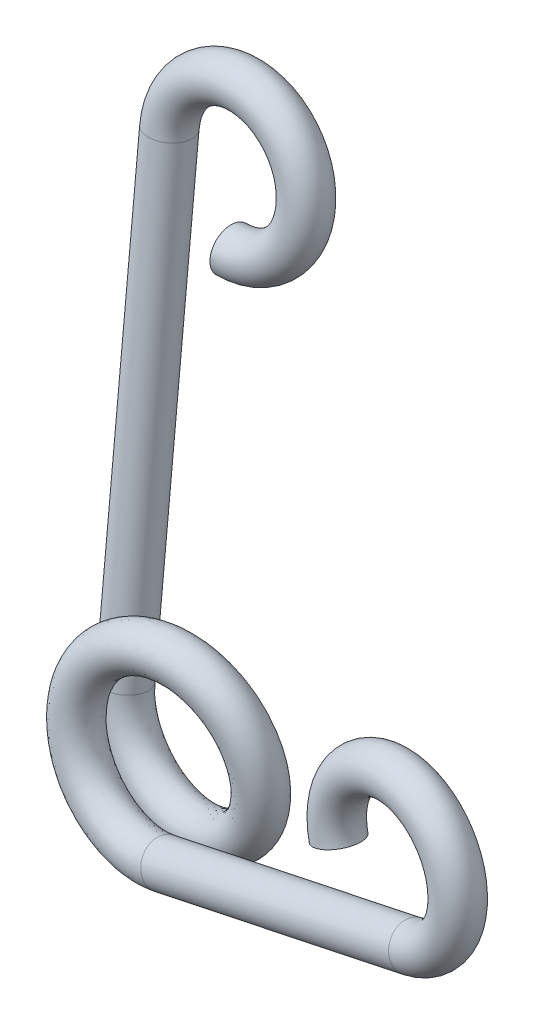
ISO-10303-21;
HEADER;
FILE_DESCRIPTION(('STEP AP214'),'2;1');
FILE_NAME('part.step','',(''),(''),'','','');
FILE_SCHEMA(('AUTOMOTIVE_DESIGN { 1 0 10303 214 1 1 1 1 }'));
ENDSEC;
DATA;
#1=APPLICATION_CONTEXT('core data for automotive mechanical design processes');
#2=APPLICATION_PROTOCOL_DEFINITION('international standard','automotive_design',2000,#1);
#3=PRODUCT_CONTEXT('',#1,'mechanical');
#4=PRODUCT('Part','Part','',(#3));
#5=PRODUCT_RELATED_PRODUCT_CATEGORY('part','',(#4));
#6=PRODUCT_DEFINITION_FORMATION('','',#4);
#7=PRODUCT_DEFINITION_CONTEXT('part definition',#1,'design');
#8=PRODUCT_DEFINITION('design','',#6,#7);
#9=PRODUCT_DEFINITION_SHAPE('','',#8);
#10=(LENGTH_UNIT() NAMED_UNIT(*) SI_UNIT(.MILLI.,.METRE.));
#11=(NAMED_UNIT(*) PLANE_ANGLE_UNIT() SI_UNIT($,.RADIAN.));
#12=(NAMED_UNIT(*) SI_UNIT($,.STERADIAN.) SOLID_ANGLE_UNIT());
#13=UNCERTAINTY_MEASURE_WITH_UNIT(LENGTH_MEASURE(1.E-05),#10,'distance_accuracy_value','');
#14=(GEOMETRIC_REPRESENTATION_CONTEXT(3) GLOBAL_UNCERTAINTY_ASSIGNED_CONTEXT((#13)) GLOBAL_UNIT_ASSIGNED_CONTEXT((#10,
#11,#12)) REPRESENTATION_CONTEXT('',''));
#15=CARTESIAN_POINT('',(0.,0.,0.));
#16=DIRECTION('',(0.,0.,1.));
#17=DIRECTION('',(1.,0.,0.));
#18=AXIS2_PLACEMENT_3D('',#15,#16,#17);
#19=CARTESIAN_POINT('',(-2.925,-0.0743899060389697,-0.768407536323998));
#20=CARTESIAN_POINT('',(-2.90082925432702,-1.02478001752022,-0.679446847372885));
#21=CARTESIAN_POINT('',(-2.32264941885759,-1.77945456115097,-0.590486158421771));
#22=CARTESIAN_POINT('',(-1.74446958338816,-2.53412910478171,-0.501525469470658));
#23=CARTESIAN_POINT('',(-0.833125703661775,-2.80482805533932,-0.412564780519545));
#24=CARTESIAN_POINT('',(0.0782181760646105,-3.07552700589693,-0.323604091568432));
#25=CARTESIAN_POINT('',(0.974623713431667,-2.75885256498733,-0.234643402617318));
#26=CARTESIAN_POINT('',(1.87102925079872,-2.44217812407772,-0.145682713666205));
#27=CARTESIAN_POINT('',(2.41009999823585,-1.65908916476,-0.0567220247150916));
#28=CARTESIAN_POINT('',(2.94917074567298,-0.876000205442282,0.0322386642360217));
#29=CARTESIAN_POINT('',(2.925,0.0743899060389693,0.121199353187135));
#30=CARTESIAN_POINT('',(2.90082925432702,1.02478001752022,0.210160042138248));
#31=CARTESIAN_POINT('',(2.32264941885759,1.77945456115097,0.299120731089362));
#32=CARTESIAN_POINT('',(1.74446958338816,2.53412910478171,0.388081420040475));
#33=CARTESIAN_POINT('',(0.833125703661776,2.80482805533932,0.477042108991588));
#34=CARTESIAN_POINT('',(-0.0782181760646102,3.07552700589693,0.566002797942702));
#35=CARTESIAN_POINT('',(-0.974623713431667,2.75885256498733,0.654963486893815));
#36=CARTESIAN_POINT('',(-1.87102925079872,2.44217812407772,0.743924175844928));
#37=CARTESIAN_POINT('',(-2.41009999823585,1.65908916476,0.832884864796042));
#38=CARTESIAN_POINT('',(-2.94917074567298,0.876000205442282,0.921845553747155));
#39=CARTESIAN_POINT('',(-2.925,-0.0743899060389697,1.01080624269827));
#40=CARTESIAN_POINT('',(-2.90082925432702,-1.02478001752022,1.09976693164938));
#41=CARTESIAN_POINT('',(-2.32264941885759,-1.77945456115097,1.18872762060049));
#42=CARTESIAN_POINT('',(-1.74446958338816,-2.53412910478171,1.27768830955161));
#43=CARTESIAN_POINT('',(-0.833125703661775,-2.80482805533932,1.36664899850272));
#44=CARTESIAN_POINT('',(0.0292959069135489,-3.06099549127035,1.45083414787372));
#45=CARTESIAN_POINT('',(0.886656578344081,-2.78836851405973,1.53584428331768));
#46=CARTESIAN_POINT('',(-1.381,-0.0743899060389595,-0.768407536323999));
#47=CARTESIAN_POINT('',(-1.35682925432703,-0.523104006536603,-0.679446847372886));
#48=CARTESIAN_POINT('',(-1.07352717954268,-0.871914131611379,-0.590486158421773));
#49=CARTESIAN_POINT('',(-0.790225104758332,-1.22072425668616,-0.501525469470659));
#50=CARTESIAN_POINT('',(-0.356003464346866,-1.3363967941796,-0.412564780519546));
#51=CARTESIAN_POINT('',(0.0782181760646,-1.45206933167305,-0.323604091568433));
#52=CARTESIAN_POINT('',(0.497501474116739,-1.29042130382761,-0.234643402617319));
#53=CARTESIAN_POINT('',(0.916784772168878,-1.12877327598218,-0.145682713666206));
#54=CARTESIAN_POINT('',(1.16097775892093,-0.751548735220432,-0.0567220247150927));
#55=CARTESIAN_POINT('',(1.40517074567297,-0.374324194458684,0.0322386642360206));
#56=CARTESIAN_POINT('',(1.381,0.0743899060389594,0.121199353187134));
#57=CARTESIAN_POINT('',(1.35682925432703,0.523104006536603,0.210160042138247));
#58=CARTESIAN_POINT('',(1.07352717954268,0.871914131611379,0.299120731089361));
#59=CARTESIAN_POINT('',(0.790225104758332,1.22072425668616,0.388081420040474));
#60=CARTESIAN_POINT('',(0.356003464346866,1.3363967941796,0.477042108991587));
#61=CARTESIAN_POINT('',(-0.0782181760645998,1.45206933167305,0.566002797942701));
#62=CARTESIAN_POINT('',(-0.497501474116739,1.29042130382761,0.654963486893814));
#63=CARTESIAN_POINT('',(-0.916784772168878,1.12877327598218,0.743924175844927));
#64=CARTESIAN_POINT('',(-1.16097775892093,0.751548735220432,0.832884864796041));
#65=CARTESIAN_POINT('',(-1.40517074567297,0.374324194458685,0.921845553747154));
#66=CARTESIAN_POINT('',(-1.381,-0.0743899060389595,1.01080624269827));
#67=CARTESIAN_POINT('',(-1.35682925432703,-0.523104006536603,1.09976693164938));
#68=CARTESIAN_POINT('',(-1.07352717954268,-0.871914131611379,1.18872762060049));
#69=CARTESIAN_POINT('',(-0.790225104758332,-1.22072425668616,1.27768830955161));
#70=CARTESIAN_POINT('',(-0.356003464346866,-1.3363967941796,1.36664899850272));
#71=CARTESIAN_POINT('',(0.0549085248604869,-1.44585986108952,1.45083414787372));
#72=CARTESIAN_POINT('',(0.456334932902209,-1.30554712175916,1.53584428331768));
#73=CARTESIAN_POINT('',(-1.381,0.0743899060389389,0.768407536323997));
#74=CARTESIAN_POINT('',(-1.40517074567297,-0.374324194458705,0.85736822527511));
#75=CARTESIAN_POINT('',(-1.16097775892091,-0.751548735220449,0.946328914226224));
#76=CARTESIAN_POINT('',(-0.916784772168861,-1.12877327598219,1.03528960317734));
#77=CARTESIAN_POINT('',(-0.49750147411672,-1.29042130382762,1.12425029212845));
#78=CARTESIAN_POINT('',(-0.0782181760645785,-1.45206933167305,1.21321098107956));
#79=CARTESIAN_POINT('',(0.356003464346885,-1.3363967941796,1.30217167003068));
#80=CARTESIAN_POINT('',(0.790225104758349,-1.22072425668614,1.39113235898179));
#81=CARTESIAN_POINT('',(1.07352717954269,-0.871914131611363,1.4800930479329));
#82=CARTESIAN_POINT('',(1.35682925432703,-0.523104006536583,1.56905373688402));
#83=CARTESIAN_POINT('',(1.381,-0.0743899060389391,1.65801442583513));
#84=CARTESIAN_POINT('',(1.40517074567297,0.374324194458705,1.74697511478624));
#85=CARTESIAN_POINT('',(1.16097775892091,0.751548735220449,1.83593580373736));
#86=CARTESIAN_POINT('',(0.916784772168861,1.12877327598219,1.92489649268847));
#87=CARTESIAN_POINT('',(0.49750147411672,1.29042130382762,2.01385718163958));
#88=CARTESIAN_POINT('',(0.0782181760645786,1.45206933167305,2.1028178705907));
#89=CARTESIAN_POINT('',(-0.356003464346885,1.3363967941796,2.19177855954181));
#90=CARTESIAN_POINT('',(-0.790225104758349,1.22072425668614,2.28073924849292));
#91=CARTESIAN_POINT('',(-1.07352717954269,0.871914131611363,2.36969993744404));
#92=CARTESIAN_POINT('',(-1.35682925432703,0.523104006536583,2.45866062639515));
#93=CARTESIAN_POINT('',(-1.381,0.0743899060389389,2.54762131534626));
#94=CARTESIAN_POINT('',(-1.40517074567297,-0.374324194458705,2.63658200429738));
#95=CARTESIAN_POINT('',(-1.16097775892091,-0.751548735220449,2.72554269324849));
#96=CARTESIAN_POINT('',(-0.916784772168861,-1.12877327598219,2.8145033821996));
#97=CARTESIAN_POINT('',(-0.49750147411672,-1.29042130382762,2.90346407115072));
#98=CARTESIAN_POINT('',(-0.100725915255201,-1.44339182968734,2.98764922052171));
#99=CARTESIAN_POINT('',(0.313450290355857,-1.34701290773189,3.07265935596567));
#100=CARTESIAN_POINT('',(-2.925,0.0743899060389288,0.768407536323998));
#101=CARTESIAN_POINT('',(-2.94917074567296,-0.876000205442322,0.857368225275111));
#102=CARTESIAN_POINT('',(-2.41009999823583,-1.65908916476004,0.946328914226225));
#103=CARTESIAN_POINT('',(-1.87102925079869,-2.44217812407775,1.03528960317734));
#104=CARTESIAN_POINT('',(-0.974623713431629,-2.75885256498734,1.12425029212845));
#105=CARTESIAN_POINT('',(-0.078218176064568,-3.07552700589693,1.21321098107957));
#106=CARTESIAN_POINT('',(0.833125703661814,-2.80482805533931,1.30217167003068));
#107=CARTESIAN_POINT('',(1.7444695833882,-2.53412910478169,1.39113235898179));
#108=CARTESIAN_POINT('',(2.32264941885762,-1.77945456115093,1.4800930479329));
#109=CARTESIAN_POINT('',(2.90082925432704,-1.02478001752018,1.56905373688402));
#110=CARTESIAN_POINT('',(2.925,-0.0743899060389292,1.65801442583513));
#111=CARTESIAN_POINT('',(2.94917074567296,0.876000205442322,1.74697511478624));
#112=CARTESIAN_POINT('',(2.41009999823583,1.65908916476003,1.83593580373736));
#113=CARTESIAN_POINT('',(1.87102925079869,2.44217812407775,1.92489649268847));
#114=CARTESIAN_POINT('',(0.974623713431629,2.75885256498734,2.01385718163958));
#115=CARTESIAN_POINT('',(0.0782181760645683,3.07552700589693,2.1028178705907));
#116=CARTESIAN_POINT('',(-0.833125703661813,2.80482805533931,2.19177855954181));
#117=CARTESIAN_POINT('',(-1.7444695833882,2.53412910478169,2.28073924849292));
#118=CARTESIAN_POINT('',(-2.32264941885762,1.77945456115093,2.36969993744404));
#119=CARTESIAN_POINT('',(-2.90082925432704,1.02478001752018,2.45866062639515));
#120=CARTESIAN_POINT('',(-2.925,0.0743899060389288,2.54762131534626));
#121=CARTESIAN_POINT('',(-2.94917074567296,-0.876000205442322,2.63658200429738));
#122=CARTESIAN_POINT('',(-2.41009999823583,-1.65908916476004,2.72554269324849));
#123=CARTESIAN_POINT('',(-1.87102925079869,-2.44217812407775,2.8145033821996));
#124=CARTESIAN_POINT('',(-0.974623713431629,-2.75885256498734,2.90346407115072));
#125=CARTESIAN_POINT('',(-0.126338533202139,-3.05852745986817,2.98764922052171));
#126=CARTESIAN_POINT('',(0.743771935797729,-2.82983430003246,3.07265935596568));
#127=CARTESIAN_POINT('',(-4.469,0.0743899060389187,0.768407536323999));
#128=CARTESIAN_POINT('',(-4.49317074567296,-1.37767621642594,0.857368225275113));
#129=CARTESIAN_POINT('',(-3.65922223755074,-2.56662959429962,0.946328914226226));
#130=CARTESIAN_POINT('',(-2.82527372942852,-3.7555829721733,1.03528960317734));
#131=CARTESIAN_POINT('',(-1.45174595274654,-4.22728382614706,1.12425029212845));
#132=CARTESIAN_POINT('',(-0.0782181760645575,-4.69898468012082,1.21321098107957));
#133=CARTESIAN_POINT('',(1.31024794297674,-4.27325931649902,1.30217167003068));
#134=CARTESIAN_POINT('',(2.69871406201804,-3.84753395287723,1.39113235898179));
#135=CARTESIAN_POINT('',(3.57177165817254,-2.6869949906905,1.48009304793291));
#136=CARTESIAN_POINT('',(4.44482925432704,-1.52645602850378,1.56905373688402));
#137=CARTESIAN_POINT('',(4.469,-0.0743899060389193,1.65801442583513));
#138=CARTESIAN_POINT('',(4.49317074567296,1.37767621642594,1.74697511478625));
#139=CARTESIAN_POINT('',(3.65922223755074,2.56662959429962,1.83593580373736));
#140=CARTESIAN_POINT('',(2.82527372942852,3.7555829721733,1.92489649268847));
#141=CARTESIAN_POINT('',(1.45174595274654,4.22728382614706,2.01385718163959));
#142=CARTESIAN_POINT('',(0.0782181760645581,4.69898468012082,2.1028178705907));
#143=CARTESIAN_POINT('',(-1.31024794297674,4.27325931649902,2.19177855954181));
#144=CARTESIAN_POINT('',(-2.69871406201804,3.84753395287723,2.28073924849293));
#145=CARTESIAN_POINT('',(-3.57177165817254,2.6869949906905,2.36969993744404));
#146=CARTESIAN_POINT('',(-4.44482925432704,1.52645602850378,2.45866062639515));
#147=CARTESIAN_POINT('',(-4.469,0.0743899060389187,2.54762131534627));
#148=CARTESIAN_POINT('',(-4.49317074567296,-1.37767621642594,2.63658200429738));
#149=CARTESIAN_POINT('',(-3.65922223755074,-2.56662959429962,2.72554269324849));
#150=CARTESIAN_POINT('',(-2.82527372942852,-3.7555829721733,2.81450338219961));
#151=CARTESIAN_POINT('',(-1.45174595274654,-4.22728382614706,2.90346407115072));
#152=CARTESIAN_POINT('',(-0.151951151149077,-4.673663090049,2.98764922052172));
#153=CARTESIAN_POINT('',(1.1740935812396,-4.31265569233303,3.07265935596568));
#154=CARTESIAN_POINT('',(-4.469,-0.0743899060389798,-0.768407536323997));
#155=CARTESIAN_POINT('',(-4.44482925432702,-1.52645602850384,-0.679446847372884));
#156=CARTESIAN_POINT('',(-3.57177165817251,-2.68699499069055,-0.590486158421771));
#157=CARTESIAN_POINT('',(-2.69871406201799,-3.84753395287727,-0.501525469470657));
#158=CARTESIAN_POINT('',(-1.31024794297668,-4.27325931649904,-0.412564780519544));
#159=CARTESIAN_POINT('',(0.0782181760646211,-4.69898468012082,-0.323604091568431));
#160=CARTESIAN_POINT('',(1.4517459527466,-4.22728382614704,-0.234643402617317));
#161=CARTESIAN_POINT('',(2.82527372942857,-3.75558297217327,-0.145682713666204));
#162=CARTESIAN_POINT('',(3.65922223755078,-2.56662959429957,-0.0567220247150907));
#163=CARTESIAN_POINT('',(4.49317074567298,-1.37767621642588,0.0322386642360226));
#164=CARTESIAN_POINT('',(4.469,0.0743899060389792,0.121199353187136));
#165=CARTESIAN_POINT('',(4.44482925432702,1.52645602850384,0.210160042138249));
#166=CARTESIAN_POINT('',(3.57177165817251,2.68699499069055,0.299120731089363));
#167=CARTESIAN_POINT('',(2.69871406201799,3.84753395287727,0.388081420040476));
#168=CARTESIAN_POINT('',(1.31024794297669,4.27325931649904,0.477042108991589));
#169=CARTESIAN_POINT('',(-0.0782181760646205,4.69898468012082,0.566002797942703));
#170=CARTESIAN_POINT('',(-1.4517459527466,4.22728382614704,0.654963486893816));
#171=CARTESIAN_POINT('',(-2.82527372942857,3.75558297217327,0.743924175844929));
#172=CARTESIAN_POINT('',(-3.65922223755078,2.56662959429957,0.832884864796043));
#173=CARTESIAN_POINT('',(-4.49317074567298,1.37767621642588,0.921845553747156));
#174=CARTESIAN_POINT('',(-4.469,-0.0743899060389798,1.01080624269827));
#175=CARTESIAN_POINT('',(-4.44482925432702,-1.52645602850384,1.09976693164938));
#176=CARTESIAN_POINT('',(-3.57177165817251,-2.68699499069055,1.1887276206005));
#177=CARTESIAN_POINT('',(-2.69871406201799,-3.84753395287727,1.27768830955161));
#178=CARTESIAN_POINT('',(-1.31024794297668,-4.27325931649904,1.36664899850272));
#179=CARTESIAN_POINT('',(0.00368328896661095,-4.67613112145118,1.45083414787372));
#180=CARTESIAN_POINT('',(1.31697822378595,-4.2711899063603,1.53584428331768));
#181=CARTESIAN_POINT('',(-2.925,-0.0743899060389697,-0.768407536323998));
#182=CARTESIAN_POINT('',(-2.90082925432702,-1.02478001752022,-0.679446847372885));
#183=CARTESIAN_POINT('',(-2.32264941885759,-1.77945456115097,-0.590486158421771));
#184=CARTESIAN_POINT('',(-1.74446958338816,-2.53412910478171,-0.501525469470658));
#185=CARTESIAN_POINT('',(-0.833125703661775,-2.80482805533932,-0.412564780519545));
#186=CARTESIAN_POINT('',(0.0782181760646105,-3.07552700589693,-0.323604091568432));
#187=CARTESIAN_POINT('',(0.974623713431667,-2.75885256498733,-0.234643402617318));
#188=CARTESIAN_POINT('',(1.87102925079872,-2.44217812407772,-0.145682713666205));
#189=CARTESIAN_POINT('',(2.41009999823585,-1.65908916476,-0.0567220247150916));
#190=CARTESIAN_POINT('',(2.94917074567298,-0.876000205442282,0.0322386642360217));
#191=CARTESIAN_POINT('',(2.925,0.0743899060389693,0.121199353187135));
#192=CARTESIAN_POINT('',(2.90082925432702,1.02478001752022,0.210160042138248));
#193=CARTESIAN_POINT('',(2.32264941885759,1.77945456115097,0.299120731089362));
#194=CARTESIAN_POINT('',(1.74446958338816,2.53412910478171,0.388081420040475));
#195=CARTESIAN_POINT('',(0.833125703661776,2.80482805533932,0.477042108991588));
#196=CARTESIAN_POINT('',(-0.0782181760646102,3.07552700589693,0.566002797942702));
#197=CARTESIAN_POINT('',(-0.974623713431667,2.75885256498733,0.654963486893815));
#198=CARTESIAN_POINT('',(-1.87102925079872,2.44217812407772,0.743924175844928));
#199=CARTESIAN_POINT('',(-2.41009999823585,1.65908916476,0.832884864796042));
#200=CARTESIAN_POINT('',(-2.94917074567298,0.876000205442282,0.921845553747155));
#201=CARTESIAN_POINT('',(-2.925,-0.0743899060389697,1.01080624269827));
#202=CARTESIAN_POINT('',(-2.90082925432702,-1.02478001752022,1.09976693164938));
#203=CARTESIAN_POINT('',(-2.32264941885759,-1.77945456115097,1.18872762060049));
#204=CARTESIAN_POINT('',(-1.74446958338816,-2.53412910478171,1.27768830955161));
#205=CARTESIAN_POINT('',(-0.833125703661775,-2.80482805533932,1.36664899850272));
#206=CARTESIAN_POINT('',(0.0292959069135489,-3.06099549127035,1.45083414787372));
#207=CARTESIAN_POINT('',(0.886656578344081,-2.78836851405973,1.53584428331768));
#208=(BOUNDED_SURFACE() B_SPLINE_SURFACE(3,2,((#19,#20,#21,#22,#23,#24,#25,#26,#27,#28,#29,#30,
#31,#32,#33,#34,#35,#36,#37,#38,#39,#40,#41,#42,#43,#44,#45),(#46,#47,#48,#49,#50,#51,#52,#53,
#54,#55,#56,#57,#58,#59,#60,#61,#62,#63,#64,#65,#66,#67,#68,#69,#70,#71,#72),(#73,#74,#75,#76,
#77,#78,#79,#80,#81,#82,#83,#84,#85,#86,#87,#88,#89,#90,#91,#92,#93,#94,#95,#96,#97,#98,#99),
(#100,#101,#102,#103,#104,#105,#106,#107,#108,#109,#110,#111,#112,#113,#114,#115,#116,#117,#118,
#119,#120,#121,#122,#123,#124,#125,#126),(#127,#128,#129,#130,#131,#132,#133,#134,#135,#136,
#137,#138,#139,#140,#141,#142,#143,#144,#145,#146,#147,#148,#149,#150,#151,#152,#153),(#154,
#155,#156,#157,#158,#159,#160,#161,#162,#163,#164,#165,#166,#167,#168,#169,#170,#171,#172,#173,
#174,#175,#176,#177,#178,#179,#180),(#181,#182,#183,#184,#185,#186,#187,#188,#189,#190,#191,
#192,#193,#194,#195,#196,#197,#198,#199,#200,#201,#202,#203,#204,#205,#206,#207)),.UNSPECIFIED.,
.T.,.F.,.F.) B_SPLINE_SURFACE_WITH_KNOTS((4,3,4),(3,2,2,2,2,2,2,2,2,2,2,2,2,3),(0.,0.5,1.),(0.,
0.05,0.1,0.15,0.2,0.25,0.3,0.35,0.4,0.45,0.5,0.55,0.6,0.647440570391907),
.UNSPECIFIED.) GEOMETRIC_REPRESENTATION_ITEM() RATIONAL_B_SPLINE_SURFACE(((1.,0.951056516295154,
1.,0.951056516295154,1.,0.951056516295154,1.,0.951056516295154,1.,0.951056516295154,1.,
0.951056516295154,1.,0.951056516295154,1.,0.951056516295154,1.,0.951056516295154,1.,
0.951056516295154,1.,0.951056516295154,1.,0.951056516295154,1.,0.953561864321502,
0.995245794423992),(0.333333333333333,0.317018838765051,0.333333333333333,0.317018838765051,
0.333333333333333,0.317018838765051,0.333333333333333,0.317018838765051,0.333333333333333,
0.317018838765051,0.333333333333333,0.317018838765051,0.333333333333333,0.317018838765051,
0.333333333333333,0.317018838765051,0.333333333333333,0.317018838765051,0.333333333333333,
0.317018838765051,0.333333333333333,0.317018838765051,0.333333333333333,0.317018838765051,
0.333333333333333,0.317853954773834,0.331748598141331),(0.333333333333333,0.317018838765051,
0.333333333333333,0.317018838765051,0.333333333333333,0.317018838765051,0.333333333333333,
0.317018838765051,0.333333333333333,0.317018838765051,0.333333333333333,0.317018838765051,
0.333333333333333,0.317018838765051,0.333333333333333,0.317018838765051,0.333333333333333,
0.317018838765051,0.333333333333333,0.317018838765051,0.333333333333333,0.317018838765051,
0.333333333333333,0.317018838765051,0.333333333333333,0.317853954773834,0.331748598141331),(1.,
0.951056516295154,1.,0.951056516295154,1.,0.951056516295154,1.,0.951056516295154,1.,
0.951056516295154,1.,0.951056516295154,1.,0.951056516295154,1.,0.951056516295154,1.,
0.951056516295154,1.,0.951056516295154,1.,0.951056516295154,1.,0.951056516295154,1.,
0.953561864321502,0.995245794423992),(0.333333333333333,0.317018838765051,0.333333333333333,
0.317018838765051,0.333333333333333,0.317018838765051,0.333333333333333,0.317018838765051,
0.333333333333333,0.317018838765051,0.333333333333333,0.317018838765051,0.333333333333333,
0.317018838765051,0.333333333333333,0.317018838765051,0.333333333333333,0.317018838765051,
0.333333333333333,0.317018838765051,0.333333333333333,0.317018838765051,0.333333333333333,
0.317018838765051,0.333333333333333,0.317853954773834,0.331748598141331),(0.333333333333333,
0.317018838765051,0.333333333333333,0.317018838765051,0.333333333333333,0.317018838765051,
0.333333333333333,0.317018838765051,0.333333333333333,0.317018838765051,0.333333333333333,
0.317018838765051,0.333333333333333,0.317018838765051,0.333333333333333,0.317018838765051,
0.333333333333333,0.317018838765051,0.333333333333333,0.317018838765051,0.333333333333333,
0.317018838765051,0.333333333333333,0.317018838765051,0.333333333333333,0.317853954773834,
0.331748598141331),(1.,0.951056516295154,1.,0.951056516295154,1.,0.951056516295154,1.,
0.951056516295154,1.,0.951056516295154,1.,0.951056516295154,1.,0.951056516295154,1.,
0.951056516295154,1.,0.951056516295154,1.,0.951056516295154,1.,0.951056516295154,1.,
0.951056516295154,1.,0.953561864321502,0.995245794423992))) REPRESENTATION_ITEM('') SURFACE());
#209=CARTESIAN_POINT('',(-2.925,0.,0.));
#210=DIRECTION('',(0.,0.995346549642484,-0.0963599819157373));
#211=DIRECTION('',(0.,0.0963599819157373,0.995346549642484));
#212=AXIS2_PLACEMENT_3D('',#209,#210,#211);
#213=CIRCLE('',#212,0.772);
#214=CARTESIAN_POINT('',(-2.925,0.0743899060389299,0.768407536323998));
#215=VERTEX_POINT('',#214);
#216=EDGE_CURVE('E49',#215,#215,#213,.T.);
#217=CARTESIAN_POINT('',(0.886656578344081,-2.78836851405973,1.53584428331768));
#218=CARTESIAN_POINT('',(1.31697822378595,-4.2711899063603,1.53584428331768));
#219=CARTESIAN_POINT('',(1.1740935812396,-4.31265569233303,3.07265935596568));
#220=CARTESIAN_POINT('',(0.743771935797729,-2.82983430003246,3.07265935596568));
#221=CARTESIAN_POINT('',(0.313450290355857,-1.34701290773189,3.07265935596567));
#222=CARTESIAN_POINT('',(0.456334932902209,-1.30554712175916,1.53584428331768));
#223=CARTESIAN_POINT('',(0.886656578344081,-2.78836851405973,1.53584428331768));
#224=(BOUNDED_CURVE() B_SPLINE_CURVE(3,(#217,#218,#219,#220,#221,#222,#223),.UNSPECIFIED.,.T.,
.F.) B_SPLINE_CURVE_WITH_KNOTS((4,3,4),(0.,0.5,1.),
.UNSPECIFIED.) CURVE() GEOMETRIC_REPRESENTATION_ITEM() RATIONAL_B_SPLINE_CURVE((0.995245794423992,
0.331748598141331,0.331748598141331,0.995245794423992,0.331748598141331,0.331748598141331,0.995245794423992)) REPRESENTATION_ITEM(''));
#225=CARTESIAN_POINT('',(0.886656578344081,-2.78836851405973,1.53584428331768));
#226=VERTEX_POINT('',#225);
#227=EDGE_CURVE('E63',#226,#226,#224,.F.);
#228=ORIENTED_EDGE('',*,*,#216,.F.);
#229=EDGE_LOOP('',(#228));
#230=FACE_BOUND('',#229,.T.);
#231=ORIENTED_EDGE('',*,*,#227,.F.);
#232=EDGE_LOOP('',(#231));
#233=FACE_BOUND('',#232,.T.);
#234=ADVANCED_FACE('F37',(#230,#233),#208,.T.);
#235=CARTESIAN_POINT('',(-2.92500000000011,16.7218220339937,-1.61884769618439));
#236=DIRECTION('',(0.,-0.995346549642484,0.0963599819157373));
#237=DIRECTION('',(0.,-0.0963599819157373,-0.995346549642485));
#238=AXIS2_PLACEMENT_3D('',#235,#236,#237);
#239=CYLINDRICAL_SURFACE('',#238,0.772);
#240=CARTESIAN_POINT('',(-2.92500000000011,16.7218220339937,-1.61884769618439));
#241=DIRECTION('',(0.,0.995346549642484,-0.0963599819157373));
#242=DIRECTION('',(0.,0.0963599819157373,0.995346549642484));
#243=AXIS2_PLACEMENT_3D('',#240,#241,#242);
#244=CIRCLE('',#243,0.772);
#245=CARTESIAN_POINT('',(-3.69700000000011,16.7218220339937,-1.61884769618438));
#246=VERTEX_POINT('',#245);
#247=EDGE_CURVE('E11',#246,#246,#244,.T.);
#248=ORIENTED_EDGE('',*,*,#247,.F.);
#249=EDGE_LOOP('',(#248));
#250=FACE_BOUND('',#249,.T.);
#251=ORIENTED_EDGE('',*,*,#216,.T.);
#252=EDGE_LOOP('',(#251));
#253=FACE_BOUND('',#252,.T.);
#254=ADVANCED_FACE('F93',(#250,#253),#239,.T.);
#255=CARTESIAN_POINT('',(10.9191563716207,0.123109457161067,3.32277682849102));
#256=DIRECTION('',(-0.955907484820231,-0.277408785639277,-0.0963599819157373));
#257=DIRECTION('',(0.27870572891313,-0.960376549417467,0.));
#258=AXIS2_PLACEMENT_3D('',#255,#256,#257);
#259=CYLINDRICAL_SURFACE('',#258,0.772000000000001);
#260=CARTESIAN_POINT('',(10.9191563716207,0.123109457161067,3.32277682849102));
#261=DIRECTION('',(0.955907484820231,0.277408785639277,0.0963599819157374));
#262=DIRECTION('',(-0.27870572891313,0.960376549417467,0.));
#263=AXIS2_PLACEMENT_3D('',#260,#261,#262);
#264=CIRCLE('',#263,0.772000000000001);
#265=CARTESIAN_POINT('',(11.1301242371455,-0.618334100364218,3.3644662842346));
#266=VERTEX_POINT('',#265);
#267=EDGE_CURVE('E54',#266,#266,#264,.T.);
#268=ORIENTED_EDGE('',*,*,#267,.F.);
#269=EDGE_LOOP('',(#268));
#270=FACE_BOUND('',#269,.T.);
#271=ORIENTED_EDGE('',*,*,#227,.T.);
#272=EDGE_LOOP('',(#271));
#273=FACE_BOUND('',#272,.T.);
#274=ADVANCED_FACE('F72',(#270,#273),#259,.T.);
#275=CARTESIAN_POINT('',(-0.425000000000123,14.2334556598875,-1.37794774139507));
#276=DIRECTION('',(-1.,0.,0.));
#277=DIRECTION('',(0.,0.0963599819157259,0.995346549642486));
#278=AXIS2_PLACEMENT_3D('',#275,#276,#277);
#279=PLANE('',#278);
#280=CARTESIAN_POINT('',(-0.425000000000123,14.2334556598875,-1.37794774139507));
#281=DIRECTION('',(-1.,0.,0.));
#282=DIRECTION('',(0.,0.0963599819157259,0.995346549642486));
#283=AXIS2_PLACEMENT_3D('',#280,#281,#282);
#284=CIRCLE('',#283,0.772);
#285=CARTESIAN_POINT('',(-0.425000000000127,13.4650481235635,-1.30355783535612));
#286=VERTEX_POINT('',#285);
#287=EDGE_CURVE('E73',#286,#286,#284,.T.);
#288=ORIENTED_EDGE('',*,*,#287,.T.);
#289=EDGE_LOOP('',(#288));
#290=FACE_BOUND('',#289,.T.);
#291=ADVANCED_FACE('F89',(#290),#279,.T.);
#292=CARTESIAN_POINT('',(-0.425000000000111,16.7218220339937,-1.61884769618442));
#293=DIRECTION('',(0.,-0.0963599819157373,-0.995346549642484));
#294=DIRECTION('',(0.,0.995346549642485,-0.0963599819157373));
#295=AXIS2_PLACEMENT_3D('',#292,#293,#294);
#296=TOROIDAL_SURFACE('',#295,2.5,0.772);
#297=CARTESIAN_POINT('',(-0.425000000000111,16.7218220339937,-1.61884769618442));
#298=DIRECTION('',(0.,-0.0963599819157373,-0.995346549642484));
#299=DIRECTION('',(0.,0.995346549642485,-0.0963599819157373));
#300=AXIS2_PLACEMENT_3D('',#297,#298,#299);
#301=CIRCLE('',#300,3.272);
#302=EDGE_CURVE('',#246,#286,#301,.T.);
#303=ORIENTED_EDGE('',*,*,#247,.T.);
#304=ORIENTED_EDGE('',*,*,#287,.F.);
#305=ORIENTED_EDGE('',*,*,#302,.T.);
#306=ORIENTED_EDGE('',*,*,#302,.F.);
#307=EDGE_LOOP('',(#303,#305,#304,#306));
#308=FACE_BOUND('',#307,.T.);
#309=ADVANCED_FACE('F94',(#308),#296,.T.);
#310=CARTESIAN_POINT('',(7.84620156654971,1.83063528297635,2.94687215950617));
#311=DIRECTION('',(0.273274437208188,-0.960419115965393,0.0540018856782057));
#312=DIRECTION('',(0.948665789818272,0.278372192358417,0.150140406786589));
#313=AXIS2_PLACEMENT_3D('',#310,#311,#312);
#314=PLANE('',#313);
#315=CARTESIAN_POINT('',(7.84620156654971,1.83063528297635,2.94687215950617));
#316=DIRECTION('',(0.273274437208188,-0.960419115965393,0.0540018856782057));
#317=DIRECTION('',(0.948665789818272,0.278372192358417,0.150140406786589));
#318=AXIS2_PLACEMENT_3D('',#315,#316,#317);
#319=CIRCLE('',#318,0.772000000000001);
#320=CARTESIAN_POINT('',(7.1082409882685,1.61647570046282,2.87248225346722));
#321=VERTEX_POINT('',#320);
#322=EDGE_CURVE('E76',#321,#321,#319,.T.);
#323=ORIENTED_EDGE('',*,*,#322,.T.);
#324=EDGE_LOOP('',(#323));
#325=FACE_BOUND('',#324,.T.);
#326=ADVANCED_FACE('F83',(#325),#314,.T.);
#327=CARTESIAN_POINT('',(10.2359702786003,2.52415724707455,3.18777211429551));
#328=DIRECTION('',(-0.107526566174176,0.0252880868867889,0.993880551287929));
#329=DIRECTION('',(0.994198490798988,0.,0.107560963611404));
#330=AXIS2_PLACEMENT_3D('',#327,#328,#329);
#331=TOROIDAL_SURFACE('',#330,2.5,0.772000000000001);
#332=CARTESIAN_POINT('',(10.2359702786003,2.52415724707455,3.18777211429551));
#333=DIRECTION('',(-0.107526566174176,0.0252880868867889,0.993880551287929));
#334=DIRECTION('',(0.994198490798988,0.,0.107560963611404));
#335=AXIS2_PLACEMENT_3D('',#332,#333,#334);
#336=CIRCLE('',#335,3.272);
#337=EDGE_CURVE('',#266,#321,#336,.T.);
#338=ORIENTED_EDGE('',*,*,#267,.T.);
#339=ORIENTED_EDGE('',*,*,#322,.F.);
#340=ORIENTED_EDGE('',*,*,#337,.T.);
#341=ORIENTED_EDGE('',*,*,#337,.F.);
#342=EDGE_LOOP('',(#338,#340,#339,#341));
#343=FACE_BOUND('',#342,.T.);
#344=ADVANCED_FACE('F85',(#343),#331,.T.);
#345=CLOSED_SHELL('',(#234,#254,#274,#291,#309,#326,#344));
#346=MANIFOLD_SOLID_BREP('B2',#345);
#347=ADVANCED_BREP_SHAPE_REPRESENTATION('',(#18,#346),#14);
#348=SHAPE_DEFINITION_REPRESENTATION(#9,#347);
ENDSEC;
END-ISO-10303-21;
